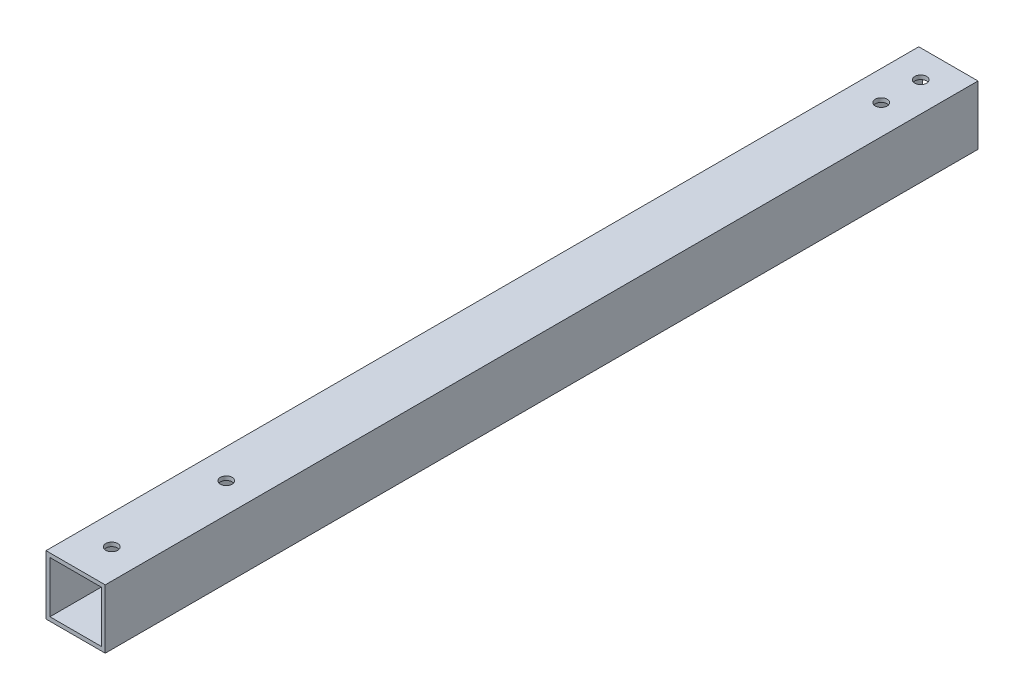
ISO-10303-21;
HEADER;
FILE_DESCRIPTION(('STEP AP214'),'2;1');
FILE_NAME('part.step','',(''),(''),'','','');
FILE_SCHEMA(('AUTOMOTIVE_DESIGN { 1 0 10303 214 1 1 1 1 }'));
ENDSEC;
DATA;
#1=APPLICATION_CONTEXT('core data for automotive mechanical design processes');
#2=APPLICATION_PROTOCOL_DEFINITION('international standard','automotive_design',2000,#1);
#3=PRODUCT_CONTEXT('',#1,'mechanical');
#4=PRODUCT('Part','Part','',(#3));
#5=PRODUCT_RELATED_PRODUCT_CATEGORY('part','',(#4));
#6=PRODUCT_DEFINITION_FORMATION('','',#4);
#7=PRODUCT_DEFINITION_CONTEXT('part definition',#1,'design');
#8=PRODUCT_DEFINITION('design','',#6,#7);
#9=PRODUCT_DEFINITION_SHAPE('','',#8);
#10=(LENGTH_UNIT() NAMED_UNIT(*) SI_UNIT(.MILLI.,.METRE.));
#11=(NAMED_UNIT(*) PLANE_ANGLE_UNIT() SI_UNIT($,.RADIAN.));
#12=(NAMED_UNIT(*) SI_UNIT($,.STERADIAN.) SOLID_ANGLE_UNIT());
#13=UNCERTAINTY_MEASURE_WITH_UNIT(LENGTH_MEASURE(1.E-05),#10,'distance_accuracy_value','');
#14=(GEOMETRIC_REPRESENTATION_CONTEXT(3) GLOBAL_UNCERTAINTY_ASSIGNED_CONTEXT((#13)) GLOBAL_UNIT_ASSIGNED_CONTEXT((#10,
#11,#12)) REPRESENTATION_CONTEXT('',''));
#15=CARTESIAN_POINT('',(0.,0.,0.));
#16=DIRECTION('',(0.,0.,1.));
#17=DIRECTION('',(1.,0.,0.));
#18=AXIS2_PLACEMENT_3D('',#15,#16,#17);
#19=CARTESIAN_POINT('',(0.,0.,221.));
#20=DIRECTION('',(0.,0.,-1.));
#21=DIRECTION('',(-1.,0.,0.));
#22=AXIS2_PLACEMENT_3D('',#19,#20,#21);
#23=PLANE('',#22);
#24=DIRECTION('',(0.,1.,0.));
#25=VECTOR('',#24,1.);
#26=CARTESIAN_POINT('',(7.5,-7.5,221.));
#27=LINE('',#26,#25);
#28=CARTESIAN_POINT('',(7.5,-7.5,221.));
#29=VERTEX_POINT('',#28);
#30=CARTESIAN_POINT('',(7.5,7.5,221.));
#31=VERTEX_POINT('',#30);
#32=EDGE_CURVE('E161',#29,#31,#27,.T.);
#33=ORIENTED_EDGE('',*,*,#32,.T.);
#34=DIRECTION('',(-1.,0.,0.));
#35=VECTOR('',#34,1.);
#36=CARTESIAN_POINT('',(-7.5,7.5,221.));
#37=LINE('',#36,#35);
#38=CARTESIAN_POINT('',(-7.5,7.5,221.));
#39=VERTEX_POINT('',#38);
#40=EDGE_CURVE('E163',#31,#39,#37,.T.);
#41=ORIENTED_EDGE('',*,*,#40,.T.);
#42=DIRECTION('',(0.,-1.,0.));
#43=VECTOR('',#42,1.);
#44=CARTESIAN_POINT('',(-7.5,-7.5,221.));
#45=LINE('',#44,#43);
#46=CARTESIAN_POINT('',(-7.5,-7.5,221.));
#47=VERTEX_POINT('',#46);
#48=EDGE_CURVE('E170',#39,#47,#45,.T.);
#49=ORIENTED_EDGE('',*,*,#48,.T.);
#50=DIRECTION('',(1.,0.,0.));
#51=VECTOR('',#50,1.);
#52=CARTESIAN_POINT('',(-7.5,-7.5,221.));
#53=LINE('',#52,#51);
#54=EDGE_CURVE('E166',#47,#29,#53,.T.);
#55=ORIENTED_EDGE('',*,*,#54,.T.);
#56=EDGE_LOOP('',(#33,#41,#49,#55));
#57=FACE_BOUND('',#56,.T.);
#58=DIRECTION('',(0.,-1.,0.));
#59=VECTOR('',#58,1.);
#60=CARTESIAN_POINT('',(-6.5,-6.5,221.));
#61=LINE('',#60,#59);
#62=CARTESIAN_POINT('',(-6.5,6.5,221.));
#63=VERTEX_POINT('',#62);
#64=CARTESIAN_POINT('',(-6.5,-6.5,221.));
#65=VERTEX_POINT('',#64);
#66=EDGE_CURVE('E124',#63,#65,#61,.T.);
#67=ORIENTED_EDGE('',*,*,#66,.F.);
#68=DIRECTION('',(-1.,0.,0.));
#69=VECTOR('',#68,1.);
#70=CARTESIAN_POINT('',(-6.5,6.5,221.));
#71=LINE('',#70,#69);
#72=CARTESIAN_POINT('',(6.5,6.5,221.));
#73=VERTEX_POINT('',#72);
#74=EDGE_CURVE('E144',#73,#63,#71,.T.);
#75=ORIENTED_EDGE('',*,*,#74,.F.);
#76=DIRECTION('',(0.,1.,0.));
#77=VECTOR('',#76,1.);
#78=CARTESIAN_POINT('',(6.5,-6.5,221.));
#79=LINE('',#78,#77);
#80=CARTESIAN_POINT('',(6.5,-6.5,221.));
#81=VERTEX_POINT('',#80);
#82=EDGE_CURVE('E141',#81,#73,#79,.T.);
#83=ORIENTED_EDGE('',*,*,#82,.F.);
#84=DIRECTION('',(1.,0.,0.));
#85=VECTOR('',#84,1.);
#86=CARTESIAN_POINT('',(-6.5,-6.5,221.));
#87=LINE('',#86,#85);
#88=EDGE_CURVE('E132',#65,#81,#87,.T.);
#89=ORIENTED_EDGE('',*,*,#88,.F.);
#90=EDGE_LOOP('',(#67,#75,#83,#89));
#91=FACE_BOUND('',#90,.T.);
#92=ADVANCED_FACE('F57',(#57,#91),#23,.F.);
#93=CARTESIAN_POINT('',(0.,0.,0.));
#94=DIRECTION('',(0.,0.,-1.));
#95=DIRECTION('',(-1.,0.,0.));
#96=AXIS2_PLACEMENT_3D('',#93,#94,#95);
#97=PLANE('',#96);
#98=DIRECTION('',(0.,1.,0.));
#99=VECTOR('',#98,1.);
#100=CARTESIAN_POINT('',(7.5,-7.5,0.));
#101=LINE('',#100,#99);
#102=CARTESIAN_POINT('',(7.5,-7.5,0.));
#103=VERTEX_POINT('',#102);
#104=CARTESIAN_POINT('',(7.5,7.5,0.));
#105=VERTEX_POINT('',#104);
#106=EDGE_CURVE('E136',#103,#105,#101,.T.);
#107=ORIENTED_EDGE('',*,*,#106,.F.);
#108=DIRECTION('',(1.,0.,0.));
#109=VECTOR('',#108,1.);
#110=CARTESIAN_POINT('',(-7.5,-7.5,0.));
#111=LINE('',#110,#109);
#112=CARTESIAN_POINT('',(-7.5,-7.5,0.));
#113=VERTEX_POINT('',#112);
#114=EDGE_CURVE('E164',#113,#103,#111,.T.);
#115=ORIENTED_EDGE('',*,*,#114,.F.);
#116=DIRECTION('',(0.,-1.,0.));
#117=VECTOR('',#116,1.);
#118=CARTESIAN_POINT('',(-7.5,-7.5,0.));
#119=LINE('',#118,#117);
#120=CARTESIAN_POINT('',(-7.5,7.5,0.));
#121=VERTEX_POINT('',#120);
#122=EDGE_CURVE('E177',#121,#113,#119,.T.);
#123=ORIENTED_EDGE('',*,*,#122,.F.);
#124=DIRECTION('',(-1.,0.,0.));
#125=VECTOR('',#124,1.);
#126=CARTESIAN_POINT('',(-7.5,7.5,0.));
#127=LINE('',#126,#125);
#128=EDGE_CURVE('E171',#105,#121,#127,.T.);
#129=ORIENTED_EDGE('',*,*,#128,.F.);
#130=EDGE_LOOP('',(#107,#115,#123,#129));
#131=FACE_BOUND('',#130,.T.);
#132=DIRECTION('',(-1.,0.,0.));
#133=VECTOR('',#132,1.);
#134=CARTESIAN_POINT('',(-6.5,6.5,0.));
#135=LINE('',#134,#133);
#136=CARTESIAN_POINT('',(6.5,6.5,0.));
#137=VERTEX_POINT('',#136);
#138=CARTESIAN_POINT('',(-6.5,6.5,0.));
#139=VERTEX_POINT('',#138);
#140=EDGE_CURVE('E134',#137,#139,#135,.T.);
#141=ORIENTED_EDGE('',*,*,#140,.T.);
#142=DIRECTION('',(0.,-1.,0.));
#143=VECTOR('',#142,1.);
#144=CARTESIAN_POINT('',(-6.5,-6.5,0.));
#145=LINE('',#144,#143);
#146=CARTESIAN_POINT('',(-6.5,-6.5,0.));
#147=VERTEX_POINT('',#146);
#148=EDGE_CURVE('E82',#139,#147,#145,.T.);
#149=ORIENTED_EDGE('',*,*,#148,.T.);
#150=DIRECTION('',(1.,0.,0.));
#151=VECTOR('',#150,1.);
#152=CARTESIAN_POINT('',(-6.5,-6.5,0.));
#153=LINE('',#152,#151);
#154=CARTESIAN_POINT('',(6.5,-6.5,0.));
#155=VERTEX_POINT('',#154);
#156=EDGE_CURVE('E139',#147,#155,#153,.T.);
#157=ORIENTED_EDGE('',*,*,#156,.T.);
#158=DIRECTION('',(0.,1.,0.));
#159=VECTOR('',#158,1.);
#160=CARTESIAN_POINT('',(6.5,-6.5,0.));
#161=LINE('',#160,#159);
#162=EDGE_CURVE('E153',#155,#137,#161,.T.);
#163=ORIENTED_EDGE('',*,*,#162,.T.);
#164=EDGE_LOOP('',(#141,#149,#157,#163));
#165=FACE_BOUND('',#164,.T.);
#166=ADVANCED_FACE('F260',(#131,#165),#97,.T.);
#167=CARTESIAN_POINT('',(7.5,-7.5,221.));
#168=DIRECTION('',(-1.,0.,0.));
#169=DIRECTION('',(0.,0.,1.));
#170=AXIS2_PLACEMENT_3D('',#167,#168,#169);
#171=PLANE('',#170);
#172=ORIENTED_EDGE('',*,*,#106,.T.);
#173=DIRECTION('',(0.,0.,-1.));
#174=VECTOR('',#173,1.);
#175=CARTESIAN_POINT('',(7.5,7.5,221.));
#176=LINE('',#175,#174);
#177=EDGE_CURVE('E12',#31,#105,#176,.T.);
#178=ORIENTED_EDGE('',*,*,#177,.F.);
#179=ORIENTED_EDGE('',*,*,#32,.F.);
#180=DIRECTION('',(0.,0.,-1.));
#181=VECTOR('',#180,1.);
#182=CARTESIAN_POINT('',(7.5,-7.5,221.));
#183=LINE('',#182,#181);
#184=EDGE_CURVE('E172',#29,#103,#183,.T.);
#185=ORIENTED_EDGE('',*,*,#184,.T.);
#186=EDGE_LOOP('',(#172,#178,#179,#185));
#187=FACE_BOUND('',#186,.T.);
#188=ADVANCED_FACE('F59',(#187),#171,.F.);
#189=CARTESIAN_POINT('',(-7.5,7.5,221.));
#190=DIRECTION('',(0.,-1.,0.));
#191=DIRECTION('',(0.,0.,-1.));
#192=AXIS2_PLACEMENT_3D('',#189,#190,#191);
#193=PLANE('',#192);
#194=CARTESIAN_POINT('',(-1.0096090630185E-12,7.5,211.85171377009));
#195=DIRECTION('',(0.,1.,0.));
#196=DIRECTION('',(0.,0.,1.));
#197=AXIS2_PLACEMENT_3D('',#194,#195,#196);
#198=CIRCLE('',#197,1.50000000000001);
#199=CARTESIAN_POINT('',(-1.0096090630185E-12,7.5,213.35171377009));
#200=VERTEX_POINT('',#199);
#201=EDGE_CURVE('E196',#200,#200,#198,.T.);
#202=ORIENTED_EDGE('',*,*,#201,.F.);
#203=EDGE_LOOP('',(#202));
#204=FACE_BOUND('',#203,.T.);
#205=CARTESIAN_POINT('',(-1.00874170128051E-12,7.5,182.85171377009));
#206=DIRECTION('',(0.,1.,0.));
#207=DIRECTION('',(0.,0.,1.));
#208=AXIS2_PLACEMENT_3D('',#205,#206,#207);
#209=CIRCLE('',#208,1.50000000000001);
#210=CARTESIAN_POINT('',(-1.00874170128051E-12,7.5,184.35171377009));
#211=VERTEX_POINT('',#210);
#212=EDGE_CURVE('E202',#211,#211,#209,.T.);
#213=ORIENTED_EDGE('',*,*,#212,.F.);
#214=EDGE_LOOP('',(#213));
#215=FACE_BOUND('',#214,.T.);
#216=CARTESIAN_POINT('',(0.,7.5,7.));
#217=DIRECTION('',(0.,1.,0.));
#218=DIRECTION('',(0.,0.,1.));
#219=AXIS2_PLACEMENT_3D('',#216,#217,#218);
#220=CIRCLE('',#219,1.5);
#221=CARTESIAN_POINT('',(0.,7.5,8.5));
#222=VERTEX_POINT('',#221);
#223=EDGE_CURVE('E188',#222,#222,#220,.T.);
#224=ORIENTED_EDGE('',*,*,#223,.F.);
#225=EDGE_LOOP('',(#224));
#226=FACE_BOUND('',#225,.T.);
#227=CARTESIAN_POINT('',(0.,7.5,17.));
#228=DIRECTION('',(0.,1.,0.));
#229=DIRECTION('',(0.,0.,1.));
#230=AXIS2_PLACEMENT_3D('',#227,#228,#229);
#231=CIRCLE('',#230,1.5);
#232=CARTESIAN_POINT('',(0.,7.5,18.5));
#233=VERTEX_POINT('',#232);
#234=EDGE_CURVE('E219',#233,#233,#231,.T.);
#235=ORIENTED_EDGE('',*,*,#234,.F.);
#236=EDGE_LOOP('',(#235));
#237=FACE_BOUND('',#236,.T.);
#238=ORIENTED_EDGE('',*,*,#128,.T.);
#239=DIRECTION('',(0.,0.,-1.));
#240=VECTOR('',#239,1.);
#241=CARTESIAN_POINT('',(-7.5,7.5,221.));
#242=LINE('',#241,#240);
#243=EDGE_CURVE('E63',#39,#121,#242,.T.);
#244=ORIENTED_EDGE('',*,*,#243,.F.);
#245=ORIENTED_EDGE('',*,*,#40,.F.);
#246=ORIENTED_EDGE('',*,*,#177,.T.);
#247=EDGE_LOOP('',(#238,#244,#245,#246));
#248=FACE_BOUND('',#247,.T.);
#249=ADVANCED_FACE('F272',(#204,#215,#226,#237,#248),#193,.F.);
#250=CARTESIAN_POINT('',(-7.5,-7.5,221.));
#251=DIRECTION('',(1.,0.,0.));
#252=DIRECTION('',(0.,0.,-1.));
#253=AXIS2_PLACEMENT_3D('',#250,#251,#252);
#254=PLANE('',#253);
#255=ORIENTED_EDGE('',*,*,#122,.T.);
#256=DIRECTION('',(0.,0.,-1.));
#257=VECTOR('',#256,1.);
#258=CARTESIAN_POINT('',(-7.5,-7.5,221.));
#259=LINE('',#258,#257);
#260=EDGE_CURVE('E182',#47,#113,#259,.T.);
#261=ORIENTED_EDGE('',*,*,#260,.F.);
#262=ORIENTED_EDGE('',*,*,#48,.F.);
#263=ORIENTED_EDGE('',*,*,#243,.T.);
#264=EDGE_LOOP('',(#255,#261,#262,#263));
#265=FACE_BOUND('',#264,.T.);
#266=ADVANCED_FACE('F269',(#265),#254,.F.);
#267=CARTESIAN_POINT('',(-7.5,-7.5,221.));
#268=DIRECTION('',(0.,1.,0.));
#269=DIRECTION('',(0.,0.,1.));
#270=AXIS2_PLACEMENT_3D('',#267,#268,#269);
#271=PLANE('',#270);
#272=CARTESIAN_POINT('',(-1.0096090630185E-12,-7.5,211.85171377009));
#273=DIRECTION('',(0.,1.,0.));
#274=DIRECTION('',(0.,0.,1.));
#275=AXIS2_PLACEMENT_3D('',#272,#273,#274);
#276=CIRCLE('',#275,1.50000000000001);
#277=CARTESIAN_POINT('',(-1.0096090630185E-12,-7.5,213.35171377009));
#278=VERTEX_POINT('',#277);
#279=EDGE_CURVE('E220',#278,#278,#276,.T.);
#280=ORIENTED_EDGE('',*,*,#279,.T.);
#281=EDGE_LOOP('',(#280));
#282=FACE_BOUND('',#281,.T.);
#283=CARTESIAN_POINT('',(-1.00874170128051E-12,-7.5,182.85171377009));
#284=DIRECTION('',(0.,1.,0.));
#285=DIRECTION('',(0.,0.,1.));
#286=AXIS2_PLACEMENT_3D('',#283,#284,#285);
#287=CIRCLE('',#286,1.50000000000001);
#288=CARTESIAN_POINT('',(-1.00874170128051E-12,-7.5,184.35171377009));
#289=VERTEX_POINT('',#288);
#290=EDGE_CURVE('E205',#289,#289,#287,.T.);
#291=ORIENTED_EDGE('',*,*,#290,.T.);
#292=EDGE_LOOP('',(#291));
#293=FACE_BOUND('',#292,.T.);
#294=CARTESIAN_POINT('',(0.,-7.5,7.));
#295=DIRECTION('',(0.,1.,0.));
#296=DIRECTION('',(0.,0.,1.));
#297=AXIS2_PLACEMENT_3D('',#294,#295,#296);
#298=CIRCLE('',#297,1.5);
#299=CARTESIAN_POINT('',(0.,-7.5,8.5));
#300=VERTEX_POINT('',#299);
#301=EDGE_CURVE('E151',#300,#300,#298,.T.);
#302=ORIENTED_EDGE('',*,*,#301,.T.);
#303=EDGE_LOOP('',(#302));
#304=FACE_BOUND('',#303,.T.);
#305=CARTESIAN_POINT('',(0.,-7.5,17.));
#306=DIRECTION('',(0.,1.,0.));
#307=DIRECTION('',(0.,0.,1.));
#308=AXIS2_PLACEMENT_3D('',#305,#306,#307);
#309=CIRCLE('',#308,1.5);
#310=CARTESIAN_POINT('',(0.,-7.5,18.5));
#311=VERTEX_POINT('',#310);
#312=EDGE_CURVE('E191',#311,#311,#309,.T.);
#313=ORIENTED_EDGE('',*,*,#312,.T.);
#314=EDGE_LOOP('',(#313));
#315=FACE_BOUND('',#314,.T.);
#316=ORIENTED_EDGE('',*,*,#114,.T.);
#317=ORIENTED_EDGE('',*,*,#184,.F.);
#318=ORIENTED_EDGE('',*,*,#54,.F.);
#319=ORIENTED_EDGE('',*,*,#260,.T.);
#320=EDGE_LOOP('',(#316,#317,#318,#319));
#321=FACE_BOUND('',#320,.T.);
#322=ADVANCED_FACE('F234',(#282,#293,#304,#315,#321),#271,.F.);
#323=CARTESIAN_POINT('',(-6.5,-6.5,221.));
#324=DIRECTION('',(1.,0.,0.));
#325=DIRECTION('',(0.,0.,-1.));
#326=AXIS2_PLACEMENT_3D('',#323,#324,#325);
#327=PLANE('',#326);
#328=ORIENTED_EDGE('',*,*,#148,.F.);
#329=DIRECTION('',(0.,0.,-1.));
#330=VECTOR('',#329,1.);
#331=CARTESIAN_POINT('',(-6.5,6.5,221.));
#332=LINE('',#331,#330);
#333=EDGE_CURVE('E130',#63,#139,#332,.T.);
#334=ORIENTED_EDGE('',*,*,#333,.F.);
#335=ORIENTED_EDGE('',*,*,#66,.T.);
#336=DIRECTION('',(0.,0.,-1.));
#337=VECTOR('',#336,1.);
#338=CARTESIAN_POINT('',(-6.5,-6.5,221.));
#339=LINE('',#338,#337);
#340=EDGE_CURVE('E127',#65,#147,#339,.T.);
#341=ORIENTED_EDGE('',*,*,#340,.T.);
#342=EDGE_LOOP('',(#328,#334,#335,#341));
#343=FACE_BOUND('',#342,.T.);
#344=ADVANCED_FACE('F123',(#343),#327,.T.);
#345=CARTESIAN_POINT('',(-6.5,-6.5,221.));
#346=DIRECTION('',(0.,1.,0.));
#347=DIRECTION('',(0.,0.,1.));
#348=AXIS2_PLACEMENT_3D('',#345,#346,#347);
#349=PLANE('',#348);
#350=CARTESIAN_POINT('',(-1.0096090630185E-12,-6.5,211.85171377009));
#351=DIRECTION('',(0.,1.,0.));
#352=DIRECTION('',(0.,0.,1.));
#353=AXIS2_PLACEMENT_3D('',#350,#351,#352);
#354=CIRCLE('',#353,1.50000000000001);
#355=CARTESIAN_POINT('',(-1.0096090630185E-12,-6.5,213.35171377009));
#356=VERTEX_POINT('',#355);
#357=EDGE_CURVE('E212',#356,#356,#354,.T.);
#358=ORIENTED_EDGE('',*,*,#357,.F.);
#359=EDGE_LOOP('',(#358));
#360=FACE_BOUND('',#359,.T.);
#361=CARTESIAN_POINT('',(-1.00874170128051E-12,-6.5,182.85171377009));
#362=DIRECTION('',(0.,1.,0.));
#363=DIRECTION('',(0.,0.,1.));
#364=AXIS2_PLACEMENT_3D('',#361,#362,#363);
#365=CIRCLE('',#364,1.50000000000001);
#366=CARTESIAN_POINT('',(-1.00874170128051E-12,-6.5,184.35171377009));
#367=VERTEX_POINT('',#366);
#368=EDGE_CURVE('E197',#367,#367,#365,.T.);
#369=ORIENTED_EDGE('',*,*,#368,.F.);
#370=EDGE_LOOP('',(#369));
#371=FACE_BOUND('',#370,.T.);
#372=CARTESIAN_POINT('',(0.,-6.5,7.));
#373=DIRECTION('',(0.,1.,0.));
#374=DIRECTION('',(0.,0.,1.));
#375=AXIS2_PLACEMENT_3D('',#372,#373,#374);
#376=CIRCLE('',#375,1.5);
#377=CARTESIAN_POINT('',(0.,-6.5,8.5));
#378=VERTEX_POINT('',#377);
#379=EDGE_CURVE('E194',#378,#378,#376,.T.);
#380=ORIENTED_EDGE('',*,*,#379,.F.);
#381=EDGE_LOOP('',(#380));
#382=FACE_BOUND('',#381,.T.);
#383=CARTESIAN_POINT('',(0.,-6.5,17.));
#384=DIRECTION('',(0.,1.,0.));
#385=DIRECTION('',(0.,0.,1.));
#386=AXIS2_PLACEMENT_3D('',#383,#384,#385);
#387=CIRCLE('',#386,1.5);
#388=CARTESIAN_POINT('',(0.,-6.5,18.5));
#389=VERTEX_POINT('',#388);
#390=EDGE_CURVE('E186',#389,#389,#387,.T.);
#391=ORIENTED_EDGE('',*,*,#390,.F.);
#392=EDGE_LOOP('',(#391));
#393=FACE_BOUND('',#392,.T.);
#394=ORIENTED_EDGE('',*,*,#156,.F.);
#395=ORIENTED_EDGE('',*,*,#340,.F.);
#396=ORIENTED_EDGE('',*,*,#88,.T.);
#397=DIRECTION('',(0.,0.,-1.));
#398=VECTOR('',#397,1.);
#399=CARTESIAN_POINT('',(6.5,-6.5,221.));
#400=LINE('',#399,#398);
#401=EDGE_CURVE('E138',#81,#155,#400,.T.);
#402=ORIENTED_EDGE('',*,*,#401,.T.);
#403=EDGE_LOOP('',(#394,#395,#396,#402));
#404=FACE_BOUND('',#403,.T.);
#405=ADVANCED_FACE('F133',(#360,#371,#382,#393,#404),#349,.T.);
#406=CARTESIAN_POINT('',(6.5,-6.5,221.));
#407=DIRECTION('',(-1.,0.,0.));
#408=DIRECTION('',(0.,-1.,0.));
#409=AXIS2_PLACEMENT_3D('',#406,#407,#408);
#410=PLANE('',#409);
#411=ORIENTED_EDGE('',*,*,#162,.F.);
#412=ORIENTED_EDGE('',*,*,#401,.F.);
#413=ORIENTED_EDGE('',*,*,#82,.T.);
#414=DIRECTION('',(0.,0.,-1.));
#415=VECTOR('',#414,1.);
#416=CARTESIAN_POINT('',(6.5,6.5,221.));
#417=LINE('',#416,#415);
#418=EDGE_CURVE('E71',#73,#137,#417,.T.);
#419=ORIENTED_EDGE('',*,*,#418,.T.);
#420=EDGE_LOOP('',(#411,#412,#413,#419));
#421=FACE_BOUND('',#420,.T.);
#422=ADVANCED_FACE('F304',(#421),#410,.T.);
#423=CARTESIAN_POINT('',(-6.5,6.5,221.));
#424=DIRECTION('',(0.,-1.,0.));
#425=DIRECTION('',(0.,0.,-1.));
#426=AXIS2_PLACEMENT_3D('',#423,#424,#425);
#427=PLANE('',#426);
#428=CARTESIAN_POINT('',(-1.0096090630185E-12,6.5,211.85171377009));
#429=DIRECTION('',(0.,-1.,0.));
#430=DIRECTION('',(0.,0.,-1.));
#431=AXIS2_PLACEMENT_3D('',#428,#429,#430);
#432=CIRCLE('',#431,1.50000000000001);
#433=CARTESIAN_POINT('',(-1.0096090630185E-12,6.5,210.35171377009));
#434=VERTEX_POINT('',#433);
#435=EDGE_CURVE('E58',#434,#434,#432,.T.);
#436=ORIENTED_EDGE('',*,*,#435,.F.);
#437=EDGE_LOOP('',(#436));
#438=FACE_BOUND('',#437,.T.);
#439=CARTESIAN_POINT('',(-1.00874170128051E-12,6.5,182.85171377009));
#440=DIRECTION('',(0.,-1.,0.));
#441=DIRECTION('',(0.,0.,-1.));
#442=AXIS2_PLACEMENT_3D('',#439,#440,#441);
#443=CIRCLE('',#442,1.50000000000001);
#444=CARTESIAN_POINT('',(-1.00874170128051E-12,6.5,181.35171377009));
#445=VERTEX_POINT('',#444);
#446=EDGE_CURVE('E193',#445,#445,#443,.T.);
#447=ORIENTED_EDGE('',*,*,#446,.F.);
#448=EDGE_LOOP('',(#447));
#449=FACE_BOUND('',#448,.T.);
#450=CARTESIAN_POINT('',(0.,6.5,7.));
#451=DIRECTION('',(0.,-1.,0.));
#452=DIRECTION('',(0.,0.,-1.));
#453=AXIS2_PLACEMENT_3D('',#450,#451,#452);
#454=CIRCLE('',#453,1.5);
#455=CARTESIAN_POINT('',(0.,6.5,8.5));
#456=VERTEX_POINT('',#455);
#457=EDGE_CURVE('E192',#456,#456,#454,.T.);
#458=ORIENTED_EDGE('',*,*,#457,.F.);
#459=EDGE_LOOP('',(#458));
#460=FACE_BOUND('',#459,.T.);
#461=CARTESIAN_POINT('',(0.,6.5,17.));
#462=DIRECTION('',(0.,-1.,0.));
#463=DIRECTION('',(0.,0.,-1.));
#464=AXIS2_PLACEMENT_3D('',#461,#462,#463);
#465=CIRCLE('',#464,1.5);
#466=CARTESIAN_POINT('',(0.,6.5,18.5));
#467=VERTEX_POINT('',#466);
#468=EDGE_CURVE('E187',#467,#467,#465,.T.);
#469=ORIENTED_EDGE('',*,*,#468,.F.);
#470=EDGE_LOOP('',(#469));
#471=FACE_BOUND('',#470,.T.);
#472=ORIENTED_EDGE('',*,*,#140,.F.);
#473=ORIENTED_EDGE('',*,*,#418,.F.);
#474=ORIENTED_EDGE('',*,*,#74,.T.);
#475=ORIENTED_EDGE('',*,*,#333,.T.);
#476=EDGE_LOOP('',(#472,#473,#474,#475));
#477=FACE_BOUND('',#476,.T.);
#478=ADVANCED_FACE('F302',(#438,#449,#460,#471,#477),#427,.T.);
#479=CARTESIAN_POINT('',(0.,-18.5,17.));
#480=DIRECTION('',(0.,1.,0.));
#481=DIRECTION('',(0.,0.,1.));
#482=AXIS2_PLACEMENT_3D('',#479,#480,#481);
#483=CYLINDRICAL_SURFACE('',#482,1.5);
#484=CARTESIAN_POINT('',(0.,6.5,18.5));
#485=CARTESIAN_POINT('',(0.,6.51041666666667,18.5));
#486=CARTESIAN_POINT('',(0.,6.52083333333334,18.5));
#487=CARTESIAN_POINT('',(0.,6.54166666666667,18.5));
#488=CARTESIAN_POINT('',(0.,6.55208333333334,18.5));
#489=CARTESIAN_POINT('',(0.,6.57291666666667,18.5));
#490=CARTESIAN_POINT('',(0.,6.58333333333334,18.5));
#491=CARTESIAN_POINT('',(0.,6.60416666666667,18.5));
#492=CARTESIAN_POINT('',(0.,6.61458333333334,18.5));
#493=CARTESIAN_POINT('',(0.,6.63541666666667,18.5));
#494=CARTESIAN_POINT('',(0.,6.64583333333334,18.5));
#495=CARTESIAN_POINT('',(0.,6.66666666666667,18.5));
#496=CARTESIAN_POINT('',(0.,6.67708333333334,18.5));
#497=CARTESIAN_POINT('',(0.,6.69791666666667,18.5));
#498=CARTESIAN_POINT('',(0.,6.70833333333334,18.5));
#499=CARTESIAN_POINT('',(0.,6.72916666666667,18.5));
#500=CARTESIAN_POINT('',(0.,6.73958333333334,18.5));
#501=CARTESIAN_POINT('',(0.,6.76041666666667,18.5));
#502=CARTESIAN_POINT('',(0.,6.77083333333333,18.5));
#503=CARTESIAN_POINT('',(0.,6.79166666666667,18.5));
#504=CARTESIAN_POINT('',(0.,6.80208333333333,18.5));
#505=CARTESIAN_POINT('',(0.,6.82291666666667,18.5));
#506=CARTESIAN_POINT('',(0.,6.83333333333333,18.5));
#507=CARTESIAN_POINT('',(0.,6.85416666666667,18.5));
#508=CARTESIAN_POINT('',(0.,6.86458333333333,18.5));
#509=CARTESIAN_POINT('',(0.,6.88541666666667,18.5));
#510=CARTESIAN_POINT('',(0.,6.89583333333333,18.5));
#511=CARTESIAN_POINT('',(0.,6.91666666666667,18.5));
#512=CARTESIAN_POINT('',(0.,6.92708333333333,18.5));
#513=CARTESIAN_POINT('',(0.,6.94791666666667,18.5));
#514=CARTESIAN_POINT('',(0.,6.95833333333333,18.5));
#515=CARTESIAN_POINT('',(0.,6.97916666666667,18.5));
#516=CARTESIAN_POINT('',(0.,6.98958333333333,18.5));
#517=CARTESIAN_POINT('',(0.,7.01041666666667,18.5));
#518=CARTESIAN_POINT('',(0.,7.02083333333333,18.5));
#519=CARTESIAN_POINT('',(0.,7.04166666666667,18.5));
#520=CARTESIAN_POINT('',(0.,7.05208333333333,18.5));
#521=CARTESIAN_POINT('',(0.,7.07291666666667,18.5));
#522=CARTESIAN_POINT('',(0.,7.08333333333333,18.5));
#523=CARTESIAN_POINT('',(0.,7.10416666666667,18.5));
#524=CARTESIAN_POINT('',(0.,7.11458333333333,18.5));
#525=CARTESIAN_POINT('',(0.,7.13541666666667,18.5));
#526=CARTESIAN_POINT('',(0.,7.14583333333333,18.5));
#527=CARTESIAN_POINT('',(0.,7.16666666666667,18.5));
#528=CARTESIAN_POINT('',(0.,7.17708333333333,18.5));
#529=CARTESIAN_POINT('',(0.,7.19791666666667,18.5));
#530=CARTESIAN_POINT('',(0.,7.20833333333333,18.5));
#531=CARTESIAN_POINT('',(0.,7.22916666666667,18.5));
#532=CARTESIAN_POINT('',(0.,7.23958333333333,18.5));
#533=CARTESIAN_POINT('',(0.,7.26041666666666,18.5));
#534=CARTESIAN_POINT('',(0.,7.27083333333333,18.5));
#535=CARTESIAN_POINT('',(0.,7.29166666666666,18.5));
#536=CARTESIAN_POINT('',(0.,7.30208333333333,18.5));
#537=CARTESIAN_POINT('',(0.,7.32291666666666,18.5));
#538=CARTESIAN_POINT('',(0.,7.33333333333333,18.5));
#539=CARTESIAN_POINT('',(0.,7.35416666666666,18.5));
#540=CARTESIAN_POINT('',(0.,7.36458333333333,18.5));
#541=CARTESIAN_POINT('',(0.,7.38541666666666,18.5));
#542=CARTESIAN_POINT('',(0.,7.39583333333333,18.5));
#543=CARTESIAN_POINT('',(0.,7.41666666666666,18.5));
#544=CARTESIAN_POINT('',(0.,7.42708333333333,18.5));
#545=CARTESIAN_POINT('',(0.,7.44791666666666,18.5));
#546=CARTESIAN_POINT('',(0.,7.45833333333333,18.5));
#547=CARTESIAN_POINT('',(0.,7.47916666666666,18.5));
#548=CARTESIAN_POINT('',(0.,7.48958333333333,18.5));
#549=CARTESIAN_POINT('',(0.,7.5,18.5));
#550=B_SPLINE_CURVE_WITH_KNOTS('',3,(#484,#485,#486,#487,#488,#489,#490,#491,#492,#493,#494,
#495,#496,#497,#498,#499,#500,#501,#502,#503,#504,#505,#506,#507,#508,#509,#510,#511,#512,#513,
#514,#515,#516,#517,#518,#519,#520,#521,#522,#523,#524,#525,#526,#527,#528,#529,#530,#531,#532,
#533,#534,#535,#536,#537,#538,#539,#540,#541,#542,#543,#544,#545,#546,#547,#548,#549),
.UNSPECIFIED.,.F.,.F.,(4,2,2,2,2,2,2,2,2,2,2,2,2,2,2,2,2,2,2,2,2,2,2,2,2,2,2,2,2,2,2,2,4),(0.,
0.03125,0.0625000000000001,0.0937500000000001,0.125,0.15625,0.1875,0.21875,0.25,
0.281249999999997,0.312499999999997,0.343749999999997,0.374999999999997,0.406249999999997,
0.437499999999997,0.468749999999997,0.499999999999997,0.531249999999997,0.562499999999997,
0.593749999999997,0.624999999999997,0.656249999999997,0.687499999999997,0.718749999999997,
0.749999999999994,0.781249999999994,0.812499999999994,0.843749999999994,0.874999999999994,
0.906249999999994,0.937499999999994,0.968749999999994,0.999999999999994),.UNSPECIFIED.);
#551=EDGE_CURVE('BSEAM251',#467,#233,#550,.T.);
#552=ORIENTED_EDGE('',*,*,#468,.T.);
#553=ORIENTED_EDGE('',*,*,#234,.T.);
#554=ORIENTED_EDGE('',*,*,#551,.T.);
#555=ORIENTED_EDGE('',*,*,#551,.F.);
#556=EDGE_LOOP('',(#552,#554,#553,#555));
#557=FACE_BOUND('',#556,.T.);
#558=ADVANCED_FACE('F251',(#557),#483,.F.);
#559=CARTESIAN_POINT('',(0.,-18.5,7.));
#560=DIRECTION('',(0.,1.,0.));
#561=DIRECTION('',(0.,0.,1.));
#562=AXIS2_PLACEMENT_3D('',#559,#560,#561);
#563=CYLINDRICAL_SURFACE('',#562,1.5);
#564=CARTESIAN_POINT('',(0.,6.5,8.5));
#565=CARTESIAN_POINT('',(0.,6.51041666666667,8.5));
#566=CARTESIAN_POINT('',(0.,6.52083333333334,8.5));
#567=CARTESIAN_POINT('',(0.,6.54166666666667,8.5));
#568=CARTESIAN_POINT('',(0.,6.55208333333334,8.5));
#569=CARTESIAN_POINT('',(0.,6.57291666666667,8.5));
#570=CARTESIAN_POINT('',(0.,6.58333333333334,8.5));
#571=CARTESIAN_POINT('',(0.,6.60416666666667,8.5));
#572=CARTESIAN_POINT('',(0.,6.61458333333334,8.5));
#573=CARTESIAN_POINT('',(0.,6.63541666666667,8.5));
#574=CARTESIAN_POINT('',(0.,6.64583333333334,8.5));
#575=CARTESIAN_POINT('',(0.,6.66666666666667,8.5));
#576=CARTESIAN_POINT('',(0.,6.67708333333334,8.5));
#577=CARTESIAN_POINT('',(0.,6.69791666666667,8.5));
#578=CARTESIAN_POINT('',(0.,6.70833333333334,8.5));
#579=CARTESIAN_POINT('',(0.,6.72916666666667,8.5));
#580=CARTESIAN_POINT('',(0.,6.73958333333334,8.5));
#581=CARTESIAN_POINT('',(0.,6.76041666666667,8.5));
#582=CARTESIAN_POINT('',(0.,6.77083333333333,8.5));
#583=CARTESIAN_POINT('',(0.,6.79166666666667,8.5));
#584=CARTESIAN_POINT('',(0.,6.80208333333333,8.5));
#585=CARTESIAN_POINT('',(0.,6.82291666666667,8.5));
#586=CARTESIAN_POINT('',(0.,6.83333333333333,8.5));
#587=CARTESIAN_POINT('',(0.,6.85416666666667,8.5));
#588=CARTESIAN_POINT('',(0.,6.86458333333333,8.5));
#589=CARTESIAN_POINT('',(0.,6.88541666666667,8.5));
#590=CARTESIAN_POINT('',(0.,6.89583333333333,8.5));
#591=CARTESIAN_POINT('',(0.,6.91666666666667,8.5));
#592=CARTESIAN_POINT('',(0.,6.92708333333333,8.5));
#593=CARTESIAN_POINT('',(0.,6.94791666666667,8.5));
#594=CARTESIAN_POINT('',(0.,6.95833333333333,8.5));
#595=CARTESIAN_POINT('',(0.,6.97916666666667,8.5));
#596=CARTESIAN_POINT('',(0.,6.98958333333333,8.5));
#597=CARTESIAN_POINT('',(0.,7.01041666666667,8.5));
#598=CARTESIAN_POINT('',(0.,7.02083333333333,8.5));
#599=CARTESIAN_POINT('',(0.,7.04166666666667,8.5));
#600=CARTESIAN_POINT('',(0.,7.05208333333333,8.5));
#601=CARTESIAN_POINT('',(0.,7.07291666666667,8.5));
#602=CARTESIAN_POINT('',(0.,7.08333333333333,8.5));
#603=CARTESIAN_POINT('',(0.,7.10416666666667,8.5));
#604=CARTESIAN_POINT('',(0.,7.11458333333333,8.5));
#605=CARTESIAN_POINT('',(0.,7.13541666666667,8.5));
#606=CARTESIAN_POINT('',(0.,7.14583333333333,8.5));
#607=CARTESIAN_POINT('',(0.,7.16666666666667,8.5));
#608=CARTESIAN_POINT('',(0.,7.17708333333333,8.5));
#609=CARTESIAN_POINT('',(0.,7.19791666666667,8.5));
#610=CARTESIAN_POINT('',(0.,7.20833333333333,8.5));
#611=CARTESIAN_POINT('',(0.,7.22916666666667,8.5));
#612=CARTESIAN_POINT('',(0.,7.23958333333333,8.5));
#613=CARTESIAN_POINT('',(0.,7.26041666666666,8.5));
#614=CARTESIAN_POINT('',(0.,7.27083333333333,8.5));
#615=CARTESIAN_POINT('',(0.,7.29166666666666,8.5));
#616=CARTESIAN_POINT('',(0.,7.30208333333333,8.5));
#617=CARTESIAN_POINT('',(0.,7.32291666666666,8.5));
#618=CARTESIAN_POINT('',(0.,7.33333333333333,8.5));
#619=CARTESIAN_POINT('',(0.,7.35416666666666,8.5));
#620=CARTESIAN_POINT('',(0.,7.36458333333333,8.5));
#621=CARTESIAN_POINT('',(0.,7.38541666666666,8.5));
#622=CARTESIAN_POINT('',(0.,7.39583333333333,8.5));
#623=CARTESIAN_POINT('',(0.,7.41666666666666,8.5));
#624=CARTESIAN_POINT('',(0.,7.42708333333333,8.5));
#625=CARTESIAN_POINT('',(0.,7.44791666666666,8.5));
#626=CARTESIAN_POINT('',(0.,7.45833333333333,8.5));
#627=CARTESIAN_POINT('',(0.,7.47916666666666,8.5));
#628=CARTESIAN_POINT('',(0.,7.48958333333333,8.5));
#629=CARTESIAN_POINT('',(0.,7.5,8.5));
#630=B_SPLINE_CURVE_WITH_KNOTS('',3,(#564,#565,#566,#567,#568,#569,#570,#571,#572,#573,#574,
#575,#576,#577,#578,#579,#580,#581,#582,#583,#584,#585,#586,#587,#588,#589,#590,#591,#592,#593,
#594,#595,#596,#597,#598,#599,#600,#601,#602,#603,#604,#605,#606,#607,#608,#609,#610,#611,#612,
#613,#614,#615,#616,#617,#618,#619,#620,#621,#622,#623,#624,#625,#626,#627,#628,#629),
.UNSPECIFIED.,.F.,.F.,(4,2,2,2,2,2,2,2,2,2,2,2,2,2,2,2,2,2,2,2,2,2,2,2,2,2,2,2,2,2,2,2,4),(0.,
0.03125,0.0625000000000001,0.0937500000000001,0.125,0.15625,0.1875,0.21875,0.25,
0.281249999999997,0.312499999999997,0.343749999999997,0.374999999999997,0.406249999999997,
0.437499999999997,0.468749999999997,0.499999999999997,0.531249999999997,0.562499999999997,
0.593749999999997,0.624999999999997,0.656249999999997,0.687499999999997,0.718749999999997,
0.749999999999994,0.781249999999994,0.812499999999994,0.843749999999994,0.874999999999994,
0.906249999999994,0.937499999999994,0.968749999999994,0.999999999999994),.UNSPECIFIED.);
#631=EDGE_CURVE('BSEAM244',#456,#222,#630,.T.);
#632=ORIENTED_EDGE('',*,*,#457,.T.);
#633=ORIENTED_EDGE('',*,*,#223,.T.);
#634=ORIENTED_EDGE('',*,*,#631,.T.);
#635=ORIENTED_EDGE('',*,*,#631,.F.);
#636=EDGE_LOOP('',(#632,#634,#633,#635));
#637=FACE_BOUND('',#636,.T.);
#638=ADVANCED_FACE('F244',(#637),#563,.F.);
#639=CARTESIAN_POINT('',(0.,-6.5,18.5));
#640=CARTESIAN_POINT('',(0.,-6.51041666666667,18.5));
#641=CARTESIAN_POINT('',(0.,-6.52083333333333,18.5));
#642=CARTESIAN_POINT('',(0.,-6.54166666666667,18.5));
#643=CARTESIAN_POINT('',(0.,-6.55208333333333,18.5));
#644=CARTESIAN_POINT('',(0.,-6.57291666666667,18.5));
#645=CARTESIAN_POINT('',(0.,-6.58333333333333,18.5));
#646=CARTESIAN_POINT('',(0.,-6.60416666666667,18.5));
#647=CARTESIAN_POINT('',(0.,-6.61458333333333,18.5));
#648=CARTESIAN_POINT('',(0.,-6.63541666666667,18.5));
#649=CARTESIAN_POINT('',(0.,-6.64583333333333,18.5));
#650=CARTESIAN_POINT('',(0.,-6.66666666666667,18.5));
#651=CARTESIAN_POINT('',(0.,-6.67708333333333,18.5));
#652=CARTESIAN_POINT('',(0.,-6.69791666666667,18.5));
#653=CARTESIAN_POINT('',(0.,-6.70833333333333,18.5));
#654=CARTESIAN_POINT('',(0.,-6.72916666666667,18.5));
#655=CARTESIAN_POINT('',(0.,-6.73958333333333,18.5));
#656=CARTESIAN_POINT('',(0.,-6.76041666666667,18.5));
#657=CARTESIAN_POINT('',(0.,-6.77083333333333,18.5));
#658=CARTESIAN_POINT('',(0.,-6.79166666666667,18.5));
#659=CARTESIAN_POINT('',(0.,-6.80208333333333,18.5));
#660=CARTESIAN_POINT('',(0.,-6.82291666666667,18.5));
#661=CARTESIAN_POINT('',(0.,-6.83333333333333,18.5));
#662=CARTESIAN_POINT('',(0.,-6.85416666666667,18.5));
#663=CARTESIAN_POINT('',(0.,-6.86458333333333,18.5));
#664=CARTESIAN_POINT('',(0.,-6.88541666666667,18.5));
#665=CARTESIAN_POINT('',(0.,-6.89583333333333,18.5));
#666=CARTESIAN_POINT('',(0.,-6.91666666666667,18.5));
#667=CARTESIAN_POINT('',(0.,-6.92708333333333,18.5));
#668=CARTESIAN_POINT('',(0.,-6.94791666666667,18.5));
#669=CARTESIAN_POINT('',(0.,-6.95833333333333,18.5));
#670=CARTESIAN_POINT('',(0.,-6.97916666666667,18.5));
#671=CARTESIAN_POINT('',(0.,-6.98958333333333,18.5));
#672=CARTESIAN_POINT('',(0.,-7.01041666666667,18.5));
#673=CARTESIAN_POINT('',(0.,-7.02083333333333,18.5));
#674=CARTESIAN_POINT('',(0.,-7.04166666666667,18.5));
#675=CARTESIAN_POINT('',(0.,-7.05208333333333,18.5));
#676=CARTESIAN_POINT('',(0.,-7.07291666666667,18.5));
#677=CARTESIAN_POINT('',(0.,-7.08333333333333,18.5));
#678=CARTESIAN_POINT('',(0.,-7.10416666666667,18.5));
#679=CARTESIAN_POINT('',(0.,-7.11458333333333,18.5));
#680=CARTESIAN_POINT('',(0.,-7.13541666666667,18.5));
#681=CARTESIAN_POINT('',(0.,-7.14583333333333,18.5));
#682=CARTESIAN_POINT('',(0.,-7.16666666666667,18.5));
#683=CARTESIAN_POINT('',(0.,-7.17708333333333,18.5));
#684=CARTESIAN_POINT('',(0.,-7.19791666666667,18.5));
#685=CARTESIAN_POINT('',(0.,-7.20833333333333,18.5));
#686=CARTESIAN_POINT('',(0.,-7.22916666666667,18.5));
#687=CARTESIAN_POINT('',(0.,-7.23958333333333,18.5));
#688=CARTESIAN_POINT('',(0.,-7.26041666666667,18.5));
#689=CARTESIAN_POINT('',(0.,-7.27083333333333,18.5));
#690=CARTESIAN_POINT('',(0.,-7.29166666666667,18.5));
#691=CARTESIAN_POINT('',(0.,-7.30208333333333,18.5));
#692=CARTESIAN_POINT('',(0.,-7.32291666666667,18.5));
#693=CARTESIAN_POINT('',(0.,-7.33333333333333,18.5));
#694=CARTESIAN_POINT('',(0.,-7.35416666666667,18.5));
#695=CARTESIAN_POINT('',(0.,-7.36458333333333,18.5));
#696=CARTESIAN_POINT('',(0.,-7.38541666666667,18.5));
#697=CARTESIAN_POINT('',(0.,-7.39583333333333,18.5));
#698=CARTESIAN_POINT('',(0.,-7.41666666666667,18.5));
#699=CARTESIAN_POINT('',(0.,-7.42708333333333,18.5));
#700=CARTESIAN_POINT('',(0.,-7.44791666666667,18.5));
#701=CARTESIAN_POINT('',(0.,-7.45833333333333,18.5));
#702=CARTESIAN_POINT('',(0.,-7.47916666666667,18.5));
#703=CARTESIAN_POINT('',(0.,-7.48958333333333,18.5));
#704=CARTESIAN_POINT('',(0.,-7.5,18.5));
#705=B_SPLINE_CURVE_WITH_KNOTS('',3,(#639,#640,#641,#642,#643,#644,#645,#646,#647,#648,#649,
#650,#651,#652,#653,#654,#655,#656,#657,#658,#659,#660,#661,#662,#663,#664,#665,#666,#667,#668,
#669,#670,#671,#672,#673,#674,#675,#676,#677,#678,#679,#680,#681,#682,#683,#684,#685,#686,#687,
#688,#689,#690,#691,#692,#693,#694,#695,#696,#697,#698,#699,#700,#701,#702,#703,#704),
.UNSPECIFIED.,.F.,.F.,(4,2,2,2,2,2,2,2,2,2,2,2,2,2,2,2,2,2,2,2,2,2,2,2,2,2,2,2,2,2,2,2,4),(0.,
0.03125,0.0625000000000001,0.0937500000000001,0.125,0.15625,0.1875,0.21875,0.25,0.28125,0.3125,
0.34375,0.375,0.40625,0.4375,0.46875,0.5,0.53125,0.5625,0.593750000000001,0.625000000000001,
0.656250000000001,0.687500000000001,0.718750000000001,0.750000000000001,0.781250000000001,
0.812500000000001,0.843750000000001,0.875000000000001,0.906250000000001,0.937500000000001,
0.968750000000001,1.),.UNSPECIFIED.);
#706=EDGE_CURVE('BSEAM239',#389,#311,#705,.T.);
#707=ORIENTED_EDGE('',*,*,#390,.T.);
#708=ORIENTED_EDGE('',*,*,#312,.F.);
#709=ORIENTED_EDGE('',*,*,#706,.T.);
#710=ORIENTED_EDGE('',*,*,#706,.F.);
#711=EDGE_LOOP('',(#707,#709,#708,#710));
#712=FACE_BOUND('',#711,.T.);
#713=ADVANCED_FACE('F239',(#712),#483,.F.);
#714=CARTESIAN_POINT('',(0.,-6.5,8.5));
#715=CARTESIAN_POINT('',(0.,-6.51041666666667,8.5));
#716=CARTESIAN_POINT('',(0.,-6.52083333333333,8.5));
#717=CARTESIAN_POINT('',(0.,-6.54166666666667,8.5));
#718=CARTESIAN_POINT('',(0.,-6.55208333333333,8.5));
#719=CARTESIAN_POINT('',(0.,-6.57291666666667,8.5));
#720=CARTESIAN_POINT('',(0.,-6.58333333333333,8.5));
#721=CARTESIAN_POINT('',(0.,-6.60416666666667,8.5));
#722=CARTESIAN_POINT('',(0.,-6.61458333333333,8.5));
#723=CARTESIAN_POINT('',(0.,-6.63541666666667,8.5));
#724=CARTESIAN_POINT('',(0.,-6.64583333333333,8.5));
#725=CARTESIAN_POINT('',(0.,-6.66666666666667,8.5));
#726=CARTESIAN_POINT('',(0.,-6.67708333333333,8.5));
#727=CARTESIAN_POINT('',(0.,-6.69791666666667,8.5));
#728=CARTESIAN_POINT('',(0.,-6.70833333333333,8.5));
#729=CARTESIAN_POINT('',(0.,-6.72916666666667,8.5));
#730=CARTESIAN_POINT('',(0.,-6.73958333333333,8.5));
#731=CARTESIAN_POINT('',(0.,-6.76041666666667,8.5));
#732=CARTESIAN_POINT('',(0.,-6.77083333333333,8.5));
#733=CARTESIAN_POINT('',(0.,-6.79166666666667,8.5));
#734=CARTESIAN_POINT('',(0.,-6.80208333333333,8.5));
#735=CARTESIAN_POINT('',(0.,-6.82291666666667,8.5));
#736=CARTESIAN_POINT('',(0.,-6.83333333333333,8.5));
#737=CARTESIAN_POINT('',(0.,-6.85416666666667,8.5));
#738=CARTESIAN_POINT('',(0.,-6.86458333333333,8.5));
#739=CARTESIAN_POINT('',(0.,-6.88541666666667,8.5));
#740=CARTESIAN_POINT('',(0.,-6.89583333333333,8.5));
#741=CARTESIAN_POINT('',(0.,-6.91666666666667,8.5));
#742=CARTESIAN_POINT('',(0.,-6.92708333333333,8.5));
#743=CARTESIAN_POINT('',(0.,-6.94791666666667,8.5));
#744=CARTESIAN_POINT('',(0.,-6.95833333333333,8.5));
#745=CARTESIAN_POINT('',(0.,-6.97916666666667,8.5));
#746=CARTESIAN_POINT('',(0.,-6.98958333333333,8.5));
#747=CARTESIAN_POINT('',(0.,-7.01041666666667,8.5));
#748=CARTESIAN_POINT('',(0.,-7.02083333333333,8.5));
#749=CARTESIAN_POINT('',(0.,-7.04166666666667,8.5));
#750=CARTESIAN_POINT('',(0.,-7.05208333333333,8.5));
#751=CARTESIAN_POINT('',(0.,-7.07291666666667,8.5));
#752=CARTESIAN_POINT('',(0.,-7.08333333333333,8.5));
#753=CARTESIAN_POINT('',(0.,-7.10416666666667,8.5));
#754=CARTESIAN_POINT('',(0.,-7.11458333333333,8.5));
#755=CARTESIAN_POINT('',(0.,-7.13541666666667,8.5));
#756=CARTESIAN_POINT('',(0.,-7.14583333333333,8.5));
#757=CARTESIAN_POINT('',(0.,-7.16666666666667,8.5));
#758=CARTESIAN_POINT('',(0.,-7.17708333333333,8.5));
#759=CARTESIAN_POINT('',(0.,-7.19791666666667,8.5));
#760=CARTESIAN_POINT('',(0.,-7.20833333333333,8.5));
#761=CARTESIAN_POINT('',(0.,-7.22916666666667,8.5));
#762=CARTESIAN_POINT('',(0.,-7.23958333333333,8.5));
#763=CARTESIAN_POINT('',(0.,-7.26041666666667,8.5));
#764=CARTESIAN_POINT('',(0.,-7.27083333333333,8.5));
#765=CARTESIAN_POINT('',(0.,-7.29166666666667,8.5));
#766=CARTESIAN_POINT('',(0.,-7.30208333333333,8.5));
#767=CARTESIAN_POINT('',(0.,-7.32291666666667,8.5));
#768=CARTESIAN_POINT('',(0.,-7.33333333333333,8.5));
#769=CARTESIAN_POINT('',(0.,-7.35416666666667,8.5));
#770=CARTESIAN_POINT('',(0.,-7.36458333333333,8.5));
#771=CARTESIAN_POINT('',(0.,-7.38541666666667,8.5));
#772=CARTESIAN_POINT('',(0.,-7.39583333333333,8.5));
#773=CARTESIAN_POINT('',(0.,-7.41666666666667,8.5));
#774=CARTESIAN_POINT('',(0.,-7.42708333333333,8.5));
#775=CARTESIAN_POINT('',(0.,-7.44791666666667,8.5));
#776=CARTESIAN_POINT('',(0.,-7.45833333333333,8.5));
#777=CARTESIAN_POINT('',(0.,-7.47916666666667,8.5));
#778=CARTESIAN_POINT('',(0.,-7.48958333333333,8.5));
#779=CARTESIAN_POINT('',(0.,-7.5,8.5));
#780=B_SPLINE_CURVE_WITH_KNOTS('',3,(#714,#715,#716,#717,#718,#719,#720,#721,#722,#723,#724,
#725,#726,#727,#728,#729,#730,#731,#732,#733,#734,#735,#736,#737,#738,#739,#740,#741,#742,#743,
#744,#745,#746,#747,#748,#749,#750,#751,#752,#753,#754,#755,#756,#757,#758,#759,#760,#761,#762,
#763,#764,#765,#766,#767,#768,#769,#770,#771,#772,#773,#774,#775,#776,#777,#778,#779),
.UNSPECIFIED.,.F.,.F.,(4,2,2,2,2,2,2,2,2,2,2,2,2,2,2,2,2,2,2,2,2,2,2,2,2,2,2,2,2,2,2,2,4),(0.,
0.03125,0.0625000000000001,0.0937500000000001,0.125,0.15625,0.1875,0.21875,0.25,0.28125,0.3125,
0.34375,0.375,0.40625,0.4375,0.46875,0.5,0.53125,0.5625,0.593750000000001,0.625000000000001,
0.656250000000001,0.687500000000001,0.718750000000001,0.750000000000001,0.781250000000001,
0.812500000000001,0.843750000000001,0.875000000000001,0.906250000000001,0.937500000000001,
0.968750000000001,1.),.UNSPECIFIED.);
#781=EDGE_CURVE('BSEAM237',#378,#300,#780,.T.);
#782=ORIENTED_EDGE('',*,*,#379,.T.);
#783=ORIENTED_EDGE('',*,*,#301,.F.);
#784=ORIENTED_EDGE('',*,*,#781,.T.);
#785=ORIENTED_EDGE('',*,*,#781,.F.);
#786=EDGE_LOOP('',(#782,#784,#783,#785));
#787=FACE_BOUND('',#786,.T.);
#788=ADVANCED_FACE('F237',(#787),#563,.F.);
#789=CARTESIAN_POINT('',(-1.00874170128051E-12,-26.5,182.85171377009));
#790=DIRECTION('',(0.,1.,0.));
#791=DIRECTION('',(0.,0.,1.));
#792=AXIS2_PLACEMENT_3D('',#789,#790,#791);
#793=CYLINDRICAL_SURFACE('',#792,1.50000000000001);
#794=ORIENTED_EDGE('',*,*,#446,.T.);
#795=EDGE_LOOP('',(#794));
#796=FACE_BOUND('',#795,.T.);
#797=ORIENTED_EDGE('',*,*,#212,.T.);
#798=EDGE_LOOP('',(#797));
#799=FACE_BOUND('',#798,.T.);
#800=ADVANCED_FACE('F236',(#796,#799),#793,.F.);
#801=CARTESIAN_POINT('',(-1.0096090630185E-12,-26.5,211.85171377009));
#802=DIRECTION('',(0.,1.,0.));
#803=DIRECTION('',(0.,0.,1.));
#804=AXIS2_PLACEMENT_3D('',#801,#802,#803);
#805=CYLINDRICAL_SURFACE('',#804,1.50000000000001);
#806=ORIENTED_EDGE('',*,*,#435,.T.);
#807=EDGE_LOOP('',(#806));
#808=FACE_BOUND('',#807,.T.);
#809=ORIENTED_EDGE('',*,*,#201,.T.);
#810=EDGE_LOOP('',(#809));
#811=FACE_BOUND('',#810,.T.);
#812=ADVANCED_FACE('F249',(#808,#811),#805,.F.);
#813=ORIENTED_EDGE('',*,*,#368,.T.);
#814=EDGE_LOOP('',(#813));
#815=FACE_BOUND('',#814,.T.);
#816=ORIENTED_EDGE('',*,*,#290,.F.);
#817=EDGE_LOOP('',(#816));
#818=FACE_BOUND('',#817,.T.);
#819=ADVANCED_FACE('F248',(#815,#818),#793,.F.);
#820=ORIENTED_EDGE('',*,*,#357,.T.);
#821=EDGE_LOOP('',(#820));
#822=FACE_BOUND('',#821,.T.);
#823=ORIENTED_EDGE('',*,*,#279,.F.);
#824=EDGE_LOOP('',(#823));
#825=FACE_BOUND('',#824,.T.);
#826=ADVANCED_FACE('F335',(#822,#825),#805,.F.);
#827=CLOSED_SHELL('',(#92,#166,#188,#249,#266,#322,#344,#405,#422,#478,#558,#638,#713,#788,#800,
#812,#819,#826));
#828=MANIFOLD_SOLID_BREP('B2',#827);
#829=ADVANCED_BREP_SHAPE_REPRESENTATION('',(#18,#828),#14);
#830=SHAPE_DEFINITION_REPRESENTATION(#9,#829);
ENDSEC;
END-ISO-10303-21;
